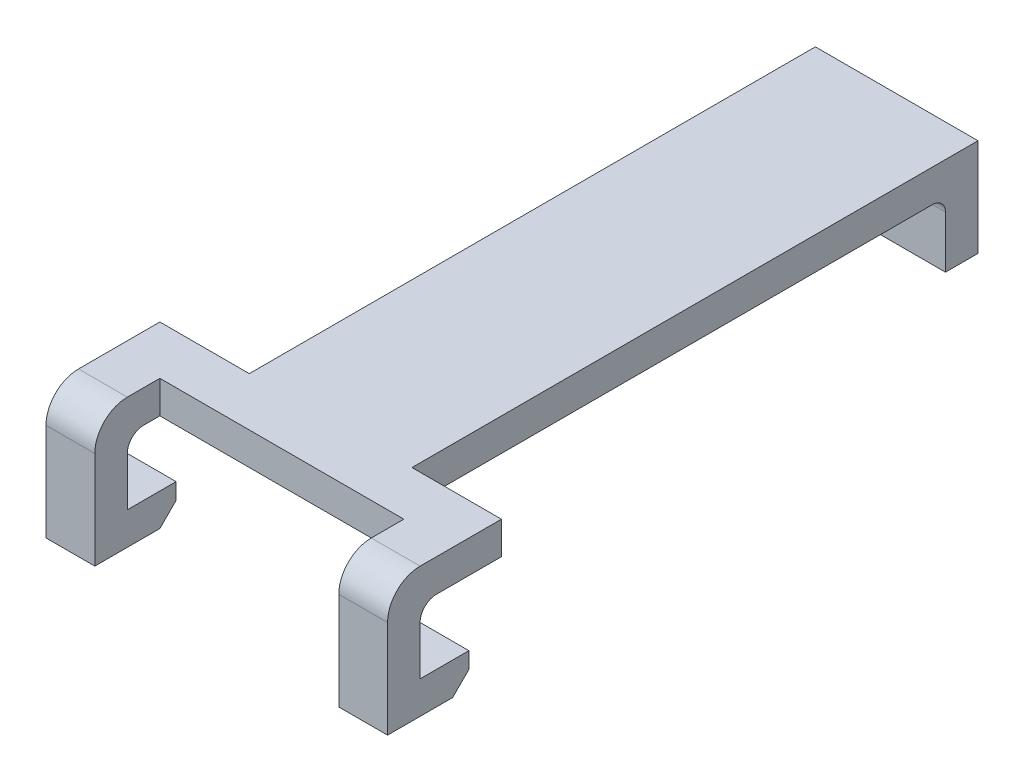
ISO-10303-21;
HEADER;
FILE_DESCRIPTION(('STEP AP214'),'2;1');
FILE_NAME('part.step','',(''),(''),'','','');
FILE_SCHEMA(('AUTOMOTIVE_DESIGN { 1 0 10303 214 1 1 1 1 }'));
ENDSEC;
DATA;
#1=APPLICATION_CONTEXT('core data for automotive mechanical design processes');
#2=APPLICATION_PROTOCOL_DEFINITION('international standard','automotive_design',2000,#1);
#3=PRODUCT_CONTEXT('',#1,'mechanical');
#4=PRODUCT('Part','Part','',(#3));
#5=PRODUCT_RELATED_PRODUCT_CATEGORY('part','',(#4));
#6=PRODUCT_DEFINITION_FORMATION('','',#4);
#7=PRODUCT_DEFINITION_CONTEXT('part definition',#1,'design');
#8=PRODUCT_DEFINITION('design','',#6,#7);
#9=PRODUCT_DEFINITION_SHAPE('','',#8);
#10=(LENGTH_UNIT() NAMED_UNIT(*) SI_UNIT(.MILLI.,.METRE.));
#11=(NAMED_UNIT(*) PLANE_ANGLE_UNIT() SI_UNIT($,.RADIAN.));
#12=(NAMED_UNIT(*) SI_UNIT($,.STERADIAN.) SOLID_ANGLE_UNIT());
#13=UNCERTAINTY_MEASURE_WITH_UNIT(LENGTH_MEASURE(1.E-05),#10,'distance_accuracy_value','');
#14=(GEOMETRIC_REPRESENTATION_CONTEXT(3) GLOBAL_UNCERTAINTY_ASSIGNED_CONTEXT((#13)) GLOBAL_UNIT_ASSIGNED_CONTEXT((#10,
#11,#12)) REPRESENTATION_CONTEXT('',''));
#15=CARTESIAN_POINT('',(0.,0.,0.));
#16=DIRECTION('',(0.,0.,1.));
#17=DIRECTION('',(1.,0.,0.));
#18=AXIS2_PLACEMENT_3D('',#15,#16,#17);
#19=CARTESIAN_POINT('',(0.,1.,18.9));
#20=DIRECTION('',(0.,0.,-1.));
#21=DIRECTION('',(-1.,0.,0.));
#22=AXIS2_PLACEMENT_3D('',#19,#20,#21);
#23=PLANE('',#22);
#24=DIRECTION('',(0.,-1.,0.));
#25=VECTOR('',#24,1.);
#26=CARTESIAN_POINT('',(7.50000000000001,1.,18.9));
#27=LINE('',#26,#25);
#28=CARTESIAN_POINT('',(7.50000000000001,1.,18.9));
#29=VERTEX_POINT('',#28);
#30=CARTESIAN_POINT('',(7.50000000000001,-1.,18.9));
#31=VERTEX_POINT('',#30);
#32=EDGE_CURVE('E469',#29,#31,#27,.T.);
#33=ORIENTED_EDGE('',*,*,#32,.F.);
#34=DIRECTION('',(1.,0.,0.));
#35=VECTOR('',#34,1.);
#36=CARTESIAN_POINT('',(0.,1.,18.9));
#37=LINE('',#36,#35);
#38=CARTESIAN_POINT('',(-7.5,1.,18.9));
#39=VERTEX_POINT('',#38);
#40=EDGE_CURVE('E399',#39,#29,#37,.T.);
#41=ORIENTED_EDGE('',*,*,#40,.F.);
#42=DIRECTION('',(0.,1.,0.));
#43=VECTOR('',#42,1.);
#44=CARTESIAN_POINT('',(-7.5,1.,18.9));
#45=LINE('',#44,#43);
#46=CARTESIAN_POINT('',(-7.5,-1.,18.9));
#47=VERTEX_POINT('',#46);
#48=EDGE_CURVE('E297',#47,#39,#45,.T.);
#49=ORIENTED_EDGE('',*,*,#48,.F.);
#50=DIRECTION('',(1.,0.,0.));
#51=VECTOR('',#50,1.);
#52=CARTESIAN_POINT('',(0.,-1.,18.9));
#53=LINE('',#52,#51);
#54=EDGE_CURVE('E422',#47,#31,#53,.T.);
#55=ORIENTED_EDGE('',*,*,#54,.T.);
#56=EDGE_LOOP('',(#33,#41,#49,#55));
#57=FACE_BOUND('',#56,.T.);
#58=ADVANCED_FACE('F38',(#57),#23,.F.);
#59=CARTESIAN_POINT('',(0.,-1.,0.));
#60=DIRECTION('',(0.,1.,0.));
#61=DIRECTION('',(0.,0.,1.));
#62=AXIS2_PLACEMENT_3D('',#59,#60,#61);
#63=PLANE('',#62);
#64=DIRECTION('',(0.,0.,1.));
#65=VECTOR('',#64,1.);
#66=CARTESIAN_POINT('',(-5.,-1.,0.));
#67=LINE('',#66,#65);
#68=CARTESIAN_POINT('',(-5.,-1.,-16.1));
#69=VERTEX_POINT('',#68);
#70=CARTESIAN_POINT('',(-5.,-1.,15.9));
#71=VERTEX_POINT('',#70);
#72=EDGE_CURVE('E413',#69,#71,#67,.T.);
#73=ORIENTED_EDGE('',*,*,#72,.F.);
#74=DIRECTION('',(-1.,0.,0.));
#75=VECTOR('',#74,1.);
#76=CARTESIAN_POINT('',(5.,-1.,-16.1));
#77=LINE('',#76,#75);
#78=CARTESIAN_POINT('',(5.,-1.,-16.1));
#79=VERTEX_POINT('',#78);
#80=EDGE_CURVE('E60',#69,#79,#77,.F.);
#81=ORIENTED_EDGE('',*,*,#80,.T.);
#82=DIRECTION('',(0.,0.,1.));
#83=VECTOR('',#82,1.);
#84=CARTESIAN_POINT('',(5.,-1.,0.));
#85=LINE('',#84,#83);
#86=CARTESIAN_POINT('',(5.,-1.,15.9));
#87=VERTEX_POINT('',#86);
#88=EDGE_CURVE('E380',#79,#87,#85,.T.);
#89=ORIENTED_EDGE('',*,*,#88,.T.);
#90=DIRECTION('',(1.,0.,0.));
#91=VECTOR('',#90,1.);
#92=CARTESIAN_POINT('',(0.,-1.,15.9));
#93=LINE('',#92,#91);
#94=CARTESIAN_POINT('',(10.5,-1.,15.9));
#95=VERTEX_POINT('',#94);
#96=EDGE_CURVE('E386',#87,#95,#93,.T.);
#97=ORIENTED_EDGE('',*,*,#96,.T.);
#98=DIRECTION('',(0.,0.,1.));
#99=VECTOR('',#98,1.);
#100=CARTESIAN_POINT('',(10.5,-1.,0.));
#101=LINE('',#100,#99);
#102=CARTESIAN_POINT('',(10.5,-1.,19.9));
#103=VERTEX_POINT('',#102);
#104=EDGE_CURVE('E426',#95,#103,#101,.T.);
#105=ORIENTED_EDGE('',*,*,#104,.T.);
#106=DIRECTION('',(1.,0.,0.));
#107=VECTOR('',#106,1.);
#108=CARTESIAN_POINT('',(7.50000000000001,-1.,19.9));
#109=LINE('',#108,#107);
#110=CARTESIAN_POINT('',(7.50000000000001,-1.,19.9));
#111=VERTEX_POINT('',#110);
#112=EDGE_CURVE('E481',#111,#103,#109,.T.);
#113=ORIENTED_EDGE('',*,*,#112,.F.);
#114=DIRECTION('',(0.,0.,1.));
#115=VECTOR('',#114,1.);
#116=CARTESIAN_POINT('',(7.49999999999998,-1.,0.));
#117=LINE('',#116,#115);
#118=EDGE_CURVE('E245',#31,#111,#117,.T.);
#119=ORIENTED_EDGE('',*,*,#118,.F.);
#120=ORIENTED_EDGE('',*,*,#54,.F.);
#121=DIRECTION('',(0.,0.,-1.));
#122=VECTOR('',#121,1.);
#123=CARTESIAN_POINT('',(-7.5,-1.,0.));
#124=LINE('',#123,#122);
#125=CARTESIAN_POINT('',(-7.5,-1.,19.9));
#126=VERTEX_POINT('',#125);
#127=EDGE_CURVE('E301',#126,#47,#124,.T.);
#128=ORIENTED_EDGE('',*,*,#127,.F.);
#129=DIRECTION('',(-1.,0.,0.));
#130=VECTOR('',#129,1.);
#131=CARTESIAN_POINT('',(-7.5,-1.,19.9));
#132=LINE('',#131,#130);
#133=CARTESIAN_POINT('',(-10.5,-1.,19.9));
#134=VERTEX_POINT('',#133);
#135=EDGE_CURVE('E325',#126,#134,#132,.T.);
#136=ORIENTED_EDGE('',*,*,#135,.T.);
#137=DIRECTION('',(0.,0.,1.));
#138=VECTOR('',#137,1.);
#139=CARTESIAN_POINT('',(-10.5,-1.,0.));
#140=LINE('',#139,#138);
#141=CARTESIAN_POINT('',(-10.5,-1.,15.9));
#142=VERTEX_POINT('',#141);
#143=EDGE_CURVE('E419',#142,#134,#140,.T.);
#144=ORIENTED_EDGE('',*,*,#143,.F.);
#145=DIRECTION('',(-1.,0.,0.));
#146=VECTOR('',#145,1.);
#147=CARTESIAN_POINT('',(0.,-1.,15.9));
#148=LINE('',#147,#146);
#149=EDGE_CURVE('E416',#71,#142,#148,.T.);
#150=ORIENTED_EDGE('',*,*,#149,.F.);
#151=EDGE_LOOP('',(#73,#81,#89,#97,#105,#113,#119,#120,#128,#136,#144,#150));
#152=FACE_BOUND('',#151,.T.);
#153=ADVANCED_FACE('F557',(#152),#63,.F.);
#154=CARTESIAN_POINT('',(5.,1.,0.));
#155=DIRECTION('',(1.,0.,0.));
#156=DIRECTION('',(0.,0.,-1.));
#157=AXIS2_PLACEMENT_3D('',#154,#155,#156);
#158=PLANE('',#157);
#159=ORIENTED_EDGE('',*,*,#88,.F.);
#160=CARTESIAN_POINT('',(5.,-1.8,-16.1));
#161=DIRECTION('',(1.,0.,0.));
#162=DIRECTION('',(0.,0.,-1.));
#163=AXIS2_PLACEMENT_3D('',#160,#161,#162);
#164=CIRCLE('',#163,0.8);
#165=CARTESIAN_POINT('',(5.,-1.8,-16.9));
#166=VERTEX_POINT('',#165);
#167=EDGE_CURVE('E11',#79,#166,#164,.F.);
#168=ORIENTED_EDGE('',*,*,#167,.T.);
#169=DIRECTION('',(0.,1.,0.));
#170=VECTOR('',#169,1.);
#171=CARTESIAN_POINT('',(5.,-5.,-16.9));
#172=LINE('',#171,#170);
#173=CARTESIAN_POINT('',(5.,-5.,-16.9));
#174=VERTEX_POINT('',#173);
#175=EDGE_CURVE('E376',#174,#166,#172,.T.);
#176=ORIENTED_EDGE('',*,*,#175,.F.);
#177=DIRECTION('',(0.,0.,1.));
#178=VECTOR('',#177,1.);
#179=CARTESIAN_POINT('',(5.,-5.,-18.9));
#180=LINE('',#179,#178);
#181=CARTESIAN_POINT('',(5.,-5.,-18.9));
#182=VERTEX_POINT('',#181);
#183=EDGE_CURVE('E367',#182,#174,#180,.T.);
#184=ORIENTED_EDGE('',*,*,#183,.F.);
#185=DIRECTION('',(0.,-1.,0.));
#186=VECTOR('',#185,1.);
#187=CARTESIAN_POINT('',(5.,1.,-18.9));
#188=LINE('',#187,#186);
#189=CARTESIAN_POINT('',(5.,1.,-18.9));
#190=VERTEX_POINT('',#189);
#191=EDGE_CURVE('E449',#190,#182,#188,.T.);
#192=ORIENTED_EDGE('',*,*,#191,.F.);
#193=DIRECTION('',(0.,0.,1.));
#194=VECTOR('',#193,1.);
#195=CARTESIAN_POINT('',(5.,1.,0.));
#196=LINE('',#195,#194);
#197=CARTESIAN_POINT('',(5.,1.,15.9));
#198=VERTEX_POINT('',#197);
#199=EDGE_CURVE('E381',#190,#198,#196,.T.);
#200=ORIENTED_EDGE('',*,*,#199,.T.);
#201=DIRECTION('',(0.,-1.,0.));
#202=VECTOR('',#201,1.);
#203=CARTESIAN_POINT('',(5.,1.,15.9));
#204=LINE('',#203,#202);
#205=EDGE_CURVE('E410',#198,#87,#204,.T.);
#206=ORIENTED_EDGE('',*,*,#205,.T.);
#207=EDGE_LOOP('',(#159,#168,#176,#184,#192,#200,#206));
#208=FACE_BOUND('',#207,.T.);
#209=ADVANCED_FACE('F563',(#208),#158,.T.);
#210=CARTESIAN_POINT('',(0.,1.,-18.9));
#211=DIRECTION('',(0.,0.,-1.));
#212=DIRECTION('',(-1.,0.,0.));
#213=AXIS2_PLACEMENT_3D('',#210,#211,#212);
#214=PLANE('',#213);
#215=ORIENTED_EDGE('',*,*,#191,.T.);
#216=DIRECTION('',(1.,0.,0.));
#217=VECTOR('',#216,1.);
#218=CARTESIAN_POINT('',(-5.,-5.,-18.9));
#219=LINE('',#218,#217);
#220=CARTESIAN_POINT('',(-5.,-5.,-18.9));
#221=VERTEX_POINT('',#220);
#222=EDGE_CURVE('E363',#221,#182,#219,.T.);
#223=ORIENTED_EDGE('',*,*,#222,.F.);
#224=DIRECTION('',(0.,-1.,0.));
#225=VECTOR('',#224,1.);
#226=CARTESIAN_POINT('',(-5.,1.,-18.9));
#227=LINE('',#226,#225);
#228=CARTESIAN_POINT('',(-5.,1.,-18.9));
#229=VERTEX_POINT('',#228);
#230=EDGE_CURVE('E446',#229,#221,#227,.T.);
#231=ORIENTED_EDGE('',*,*,#230,.F.);
#232=DIRECTION('',(1.,0.,0.));
#233=VECTOR('',#232,1.);
#234=CARTESIAN_POINT('',(0.,1.,-18.9));
#235=LINE('',#234,#233);
#236=EDGE_CURVE('E385',#229,#190,#235,.T.);
#237=ORIENTED_EDGE('',*,*,#236,.T.);
#238=EDGE_LOOP('',(#215,#223,#231,#237));
#239=FACE_BOUND('',#238,.T.);
#240=ADVANCED_FACE('F580',(#239),#214,.T.);
#241=CARTESIAN_POINT('',(-5.,1.,0.));
#242=DIRECTION('',(1.,0.,0.));
#243=DIRECTION('',(0.,0.,-1.));
#244=AXIS2_PLACEMENT_3D('',#241,#242,#243);
#245=PLANE('',#244);
#246=ORIENTED_EDGE('',*,*,#230,.T.);
#247=DIRECTION('',(0.,0.,-1.));
#248=VECTOR('',#247,1.);
#249=CARTESIAN_POINT('',(-5.,-5.,-18.9));
#250=LINE('',#249,#248);
#251=CARTESIAN_POINT('',(-5.,-5.,-16.9));
#252=VERTEX_POINT('',#251);
#253=EDGE_CURVE('E329',#252,#221,#250,.T.);
#254=ORIENTED_EDGE('',*,*,#253,.F.);
#255=DIRECTION('',(0.,1.,0.));
#256=VECTOR('',#255,1.);
#257=CARTESIAN_POINT('',(-5.,-5.,-16.9));
#258=LINE('',#257,#256);
#259=CARTESIAN_POINT('',(-5.,-1.8,-16.9));
#260=VERTEX_POINT('',#259);
#261=EDGE_CURVE('E373',#252,#260,#258,.T.);
#262=ORIENTED_EDGE('',*,*,#261,.T.);
#263=CARTESIAN_POINT('',(-5.,-1.8,-16.1));
#264=DIRECTION('',(1.,0.,0.));
#265=DIRECTION('',(0.,0.,-1.));
#266=AXIS2_PLACEMENT_3D('',#263,#264,#265);
#267=CIRCLE('',#266,0.8);
#268=EDGE_CURVE('E47',#260,#69,#267,.T.);
#269=ORIENTED_EDGE('',*,*,#268,.T.);
#270=ORIENTED_EDGE('',*,*,#72,.T.);
#271=DIRECTION('',(0.,-1.,0.));
#272=VECTOR('',#271,1.);
#273=CARTESIAN_POINT('',(-5.,1.,15.9));
#274=LINE('',#273,#272);
#275=CARTESIAN_POINT('',(-5.,1.,15.9));
#276=VERTEX_POINT('',#275);
#277=EDGE_CURVE('E442',#276,#71,#274,.T.);
#278=ORIENTED_EDGE('',*,*,#277,.F.);
#279=DIRECTION('',(0.,0.,1.));
#280=VECTOR('',#279,1.);
#281=CARTESIAN_POINT('',(-5.,1.,0.));
#282=LINE('',#281,#280);
#283=EDGE_CURVE('E390',#229,#276,#282,.T.);
#284=ORIENTED_EDGE('',*,*,#283,.F.);
#285=EDGE_LOOP('',(#246,#254,#262,#269,#270,#278,#284));
#286=FACE_BOUND('',#285,.T.);
#287=ADVANCED_FACE('F576',(#286),#245,.F.);
#288=CARTESIAN_POINT('',(0.,1.,15.9));
#289=DIRECTION('',(0.,0.,1.));
#290=DIRECTION('',(1.,0.,0.));
#291=AXIS2_PLACEMENT_3D('',#288,#289,#290);
#292=PLANE('',#291);
#293=ORIENTED_EDGE('',*,*,#149,.T.);
#294=DIRECTION('',(0.,-1.,0.));
#295=VECTOR('',#294,1.);
#296=CARTESIAN_POINT('',(-10.5,1.,15.9));
#297=LINE('',#296,#295);
#298=CARTESIAN_POINT('',(-10.5,1.,15.9));
#299=VERTEX_POINT('',#298);
#300=EDGE_CURVE('E438',#299,#142,#297,.T.);
#301=ORIENTED_EDGE('',*,*,#300,.F.);
#302=DIRECTION('',(-1.,0.,0.));
#303=VECTOR('',#302,1.);
#304=CARTESIAN_POINT('',(0.,1.,15.9));
#305=LINE('',#304,#303);
#306=EDGE_CURVE('E393',#276,#299,#305,.T.);
#307=ORIENTED_EDGE('',*,*,#306,.F.);
#308=ORIENTED_EDGE('',*,*,#277,.T.);
#309=EDGE_LOOP('',(#293,#301,#307,#308));
#310=FACE_BOUND('',#309,.T.);
#311=ADVANCED_FACE('F572',(#310),#292,.F.);
#312=CARTESIAN_POINT('',(-10.5,1.,0.));
#313=DIRECTION('',(1.,0.,0.));
#314=DIRECTION('',(0.,0.,-1.));
#315=AXIS2_PLACEMENT_3D('',#312,#313,#314);
#316=PLANE('',#315);
#317=ORIENTED_EDGE('',*,*,#143,.T.);
#318=CARTESIAN_POINT('',(-10.5,-2.,19.9));
#319=DIRECTION('',(1.,0.,0.));
#320=DIRECTION('',(0.,0.,-1.));
#321=AXIS2_PLACEMENT_3D('',#318,#319,#320);
#322=CIRCLE('',#321,1.);
#323=CARTESIAN_POINT('',(-10.5,-2.,20.9));
#324=VERTEX_POINT('',#323);
#325=EDGE_CURVE('E256',#134,#324,#322,.T.);
#326=ORIENTED_EDGE('',*,*,#325,.T.);
#327=DIRECTION('',(0.,1.,0.));
#328=VECTOR('',#327,1.);
#329=CARTESIAN_POINT('',(-10.5,1.,20.9));
#330=LINE('',#329,#328);
#331=CARTESIAN_POINT('',(-10.5,-5.,20.9));
#332=VERTEX_POINT('',#331);
#333=EDGE_CURVE('E262',#332,#324,#330,.T.);
#334=ORIENTED_EDGE('',*,*,#333,.F.);
#335=DIRECTION('',(0.,0.,1.));
#336=VECTOR('',#335,1.);
#337=CARTESIAN_POINT('',(-10.5,-5.,0.));
#338=LINE('',#337,#336);
#339=CARTESIAN_POINT('',(-10.5,-5.,17.9));
#340=VERTEX_POINT('',#339);
#341=EDGE_CURVE('E308',#340,#332,#338,.T.);
#342=ORIENTED_EDGE('',*,*,#341,.F.);
#343=DIRECTION('',(0.,1.,0.));
#344=VECTOR('',#343,1.);
#345=CARTESIAN_POINT('',(-10.5,1.,17.9));
#346=LINE('',#345,#344);
#347=CARTESIAN_POINT('',(-10.5,-6.,17.9));
#348=VERTEX_POINT('',#347);
#349=EDGE_CURVE('E311',#348,#340,#346,.T.);
#350=ORIENTED_EDGE('',*,*,#349,.F.);
#351=DIRECTION('',(0.,0.707106781186546,-0.707106781186549));
#352=VECTOR('',#351,1.);
#353=CARTESIAN_POINT('',(-10.5,6.44999999999998,5.44999999999997));
#354=LINE('',#353,#352);
#355=CARTESIAN_POINT('',(-10.5,-7.,18.9));
#356=VERTEX_POINT('',#355);
#357=EDGE_CURVE('E314',#356,#348,#354,.T.);
#358=ORIENTED_EDGE('',*,*,#357,.F.);
#359=DIRECTION('',(0.,0.,-1.));
#360=VECTOR('',#359,1.);
#361=CARTESIAN_POINT('',(-10.5,-7.,0.));
#362=LINE('',#361,#360);
#363=CARTESIAN_POINT('',(-10.5,-7.,22.9));
#364=VERTEX_POINT('',#363);
#365=EDGE_CURVE('E317',#364,#356,#362,.T.);
#366=ORIENTED_EDGE('',*,*,#365,.F.);
#367=DIRECTION('',(0.,-1.,0.));
#368=VECTOR('',#367,1.);
#369=CARTESIAN_POINT('',(-10.5,1.00000000000001,22.9));
#370=LINE('',#369,#368);
#371=CARTESIAN_POINT('',(-10.5,-1.,22.9));
#372=VERTEX_POINT('',#371);
#373=EDGE_CURVE('E320',#372,#364,#370,.T.);
#374=ORIENTED_EDGE('',*,*,#373,.F.);
#375=CARTESIAN_POINT('',(-10.5,-1.,20.9));
#376=DIRECTION('',(1.,0.,0.));
#377=DIRECTION('',(0.,0.,-1.));
#378=AXIS2_PLACEMENT_3D('',#375,#376,#377);
#379=CIRCLE('',#378,2.);
#380=CARTESIAN_POINT('',(-10.5,1.,20.9));
#381=VERTEX_POINT('',#380);
#382=EDGE_CURVE('E274',#381,#372,#379,.T.);
#383=ORIENTED_EDGE('',*,*,#382,.F.);
#384=DIRECTION('',(0.,0.,1.));
#385=VECTOR('',#384,1.);
#386=CARTESIAN_POINT('',(-10.5,1.,0.));
#387=LINE('',#386,#385);
#388=EDGE_CURVE('E396',#299,#381,#387,.T.);
#389=ORIENTED_EDGE('',*,*,#388,.F.);
#390=ORIENTED_EDGE('',*,*,#300,.T.);
#391=EDGE_LOOP('',(#317,#326,#334,#342,#350,#358,#366,#374,#383,#389,#390));
#392=FACE_BOUND('',#391,.T.);
#393=ADVANCED_FACE('F569',(#392),#316,.F.);
#394=CARTESIAN_POINT('',(10.5,1.,0.));
#395=DIRECTION('',(1.,0.,0.));
#396=DIRECTION('',(0.,0.,-1.));
#397=AXIS2_PLACEMENT_3D('',#394,#395,#396);
#398=PLANE('',#397);
#399=ORIENTED_EDGE('',*,*,#104,.F.);
#400=DIRECTION('',(0.,-1.,0.));
#401=VECTOR('',#400,1.);
#402=CARTESIAN_POINT('',(10.5,1.,15.9));
#403=LINE('',#402,#401);
#404=CARTESIAN_POINT('',(10.5,1.,15.9));
#405=VERTEX_POINT('',#404);
#406=EDGE_CURVE('E435',#405,#95,#403,.T.);
#407=ORIENTED_EDGE('',*,*,#406,.F.);
#408=DIRECTION('',(0.,0.,1.));
#409=VECTOR('',#408,1.);
#410=CARTESIAN_POINT('',(10.5,1.,0.));
#411=LINE('',#410,#409);
#412=CARTESIAN_POINT('',(10.5,1.,20.9));
#413=VERTEX_POINT('',#412);
#414=EDGE_CURVE('E403',#405,#413,#411,.T.);
#415=ORIENTED_EDGE('',*,*,#414,.T.);
#416=CARTESIAN_POINT('',(10.5,-1.,20.9));
#417=DIRECTION('',(1.,0.,0.));
#418=DIRECTION('',(0.,0.,-1.));
#419=AXIS2_PLACEMENT_3D('',#416,#417,#418);
#420=CIRCLE('',#419,2.);
#421=CARTESIAN_POINT('',(10.5,-1.,22.9));
#422=VERTEX_POINT('',#421);
#423=EDGE_CURVE('E250',#413,#422,#420,.T.);
#424=ORIENTED_EDGE('',*,*,#423,.T.);
#425=DIRECTION('',(0.,1.,0.));
#426=VECTOR('',#425,1.);
#427=CARTESIAN_POINT('',(10.5,1.00000000000001,22.9));
#428=LINE('',#427,#426);
#429=CARTESIAN_POINT('',(10.5,-7.,22.9));
#430=VERTEX_POINT('',#429);
#431=EDGE_CURVE('E464',#430,#422,#428,.T.);
#432=ORIENTED_EDGE('',*,*,#431,.F.);
#433=DIRECTION('',(0.,0.,1.));
#434=VECTOR('',#433,1.);
#435=CARTESIAN_POINT('',(10.5,-7.,0.));
#436=LINE('',#435,#434);
#437=CARTESIAN_POINT('',(10.5,-7.,18.9));
#438=VERTEX_POINT('',#437);
#439=EDGE_CURVE('E466',#438,#430,#436,.T.);
#440=ORIENTED_EDGE('',*,*,#439,.F.);
#441=DIRECTION('',(0.,-0.707106781186546,0.707106781186549));
#442=VECTOR('',#441,1.);
#443=CARTESIAN_POINT('',(10.5,6.44999999999999,5.44999999999996));
#444=LINE('',#443,#442);
#445=CARTESIAN_POINT('',(10.5,-6.,17.9));
#446=VERTEX_POINT('',#445);
#447=EDGE_CURVE('E478',#446,#438,#444,.T.);
#448=ORIENTED_EDGE('',*,*,#447,.F.);
#449=DIRECTION('',(0.,-1.,0.));
#450=VECTOR('',#449,1.);
#451=CARTESIAN_POINT('',(10.5,1.,17.9));
#452=LINE('',#451,#450);
#453=CARTESIAN_POINT('',(10.5,-5.,17.9));
#454=VERTEX_POINT('',#453);
#455=EDGE_CURVE('E477',#454,#446,#452,.T.);
#456=ORIENTED_EDGE('',*,*,#455,.F.);
#457=DIRECTION('',(0.,0.,-1.));
#458=VECTOR('',#457,1.);
#459=CARTESIAN_POINT('',(10.5,-5.,0.));
#460=LINE('',#459,#458);
#461=CARTESIAN_POINT('',(10.5,-5.,20.9));
#462=VERTEX_POINT('',#461);
#463=EDGE_CURVE('E479',#462,#454,#460,.T.);
#464=ORIENTED_EDGE('',*,*,#463,.F.);
#465=DIRECTION('',(0.,-1.,0.));
#466=VECTOR('',#465,1.);
#467=CARTESIAN_POINT('',(10.5,1.,20.9));
#468=LINE('',#467,#466);
#469=CARTESIAN_POINT('',(10.5,-2.,20.9));
#470=VERTEX_POINT('',#469);
#471=EDGE_CURVE('E534',#470,#462,#468,.T.);
#472=ORIENTED_EDGE('',*,*,#471,.F.);
#473=CARTESIAN_POINT('',(10.5,-2.,19.9));
#474=DIRECTION('',(1.,0.,0.));
#475=DIRECTION('',(0.,0.,-1.));
#476=AXIS2_PLACEMENT_3D('',#473,#474,#475);
#477=CIRCLE('',#476,1.);
#478=EDGE_CURVE('E254',#103,#470,#477,.T.);
#479=ORIENTED_EDGE('',*,*,#478,.F.);
#480=EDGE_LOOP('',(#399,#407,#415,#424,#432,#440,#448,#456,#464,#472,#479));
#481=FACE_BOUND('',#480,.T.);
#482=ADVANCED_FACE('F520',(#481),#398,.T.);
#483=CARTESIAN_POINT('',(0.,1.,15.9));
#484=DIRECTION('',(0.,0.,-1.));
#485=DIRECTION('',(-1.,0.,0.));
#486=AXIS2_PLACEMENT_3D('',#483,#484,#485);
#487=PLANE('',#486);
#488=ORIENTED_EDGE('',*,*,#96,.F.);
#489=ORIENTED_EDGE('',*,*,#205,.F.);
#490=DIRECTION('',(1.,0.,0.));
#491=VECTOR('',#490,1.);
#492=CARTESIAN_POINT('',(0.,1.,15.9));
#493=LINE('',#492,#491);
#494=EDGE_CURVE('E406',#198,#405,#493,.T.);
#495=ORIENTED_EDGE('',*,*,#494,.T.);
#496=ORIENTED_EDGE('',*,*,#406,.T.);
#497=EDGE_LOOP('',(#488,#489,#495,#496));
#498=FACE_BOUND('',#497,.T.);
#499=ADVANCED_FACE('F640',(#498),#487,.T.);
#500=CARTESIAN_POINT('',(0.,1.,0.));
#501=DIRECTION('',(0.,1.,0.));
#502=DIRECTION('',(0.,0.,1.));
#503=AXIS2_PLACEMENT_3D('',#500,#501,#502);
#504=PLANE('',#503);
#505=ORIENTED_EDGE('',*,*,#199,.F.);
#506=ORIENTED_EDGE('',*,*,#236,.F.);
#507=ORIENTED_EDGE('',*,*,#283,.T.);
#508=ORIENTED_EDGE('',*,*,#306,.T.);
#509=ORIENTED_EDGE('',*,*,#388,.T.);
#510=DIRECTION('',(-1.,0.,0.));
#511=VECTOR('',#510,1.);
#512=CARTESIAN_POINT('',(-7.5,1.,20.9));
#513=LINE('',#512,#511);
#514=CARTESIAN_POINT('',(-7.5,1.,20.9));
#515=VERTEX_POINT('',#514);
#516=EDGE_CURVE('E330',#515,#381,#513,.T.);
#517=ORIENTED_EDGE('',*,*,#516,.F.);
#518=DIRECTION('',(0.,0.,1.));
#519=VECTOR('',#518,1.);
#520=CARTESIAN_POINT('',(-7.5,1.,0.));
#521=LINE('',#520,#519);
#522=EDGE_CURVE('E294',#39,#515,#521,.T.);
#523=ORIENTED_EDGE('',*,*,#522,.F.);
#524=ORIENTED_EDGE('',*,*,#40,.T.);
#525=DIRECTION('',(0.,0.,-1.));
#526=VECTOR('',#525,1.);
#527=CARTESIAN_POINT('',(7.49999999999998,1.,0.));
#528=LINE('',#527,#526);
#529=CARTESIAN_POINT('',(7.50000000000001,1.,20.9));
#530=VERTEX_POINT('',#529);
#531=EDGE_CURVE('E471',#530,#29,#528,.T.);
#532=ORIENTED_EDGE('',*,*,#531,.F.);
#533=DIRECTION('',(1.,0.,0.));
#534=VECTOR('',#533,1.);
#535=CARTESIAN_POINT('',(7.50000000000001,1.,20.9));
#536=LINE('',#535,#534);
#537=EDGE_CURVE('E482',#530,#413,#536,.T.);
#538=ORIENTED_EDGE('',*,*,#537,.T.);
#539=ORIENTED_EDGE('',*,*,#414,.F.);
#540=ORIENTED_EDGE('',*,*,#494,.F.);
#541=EDGE_LOOP('',(#505,#506,#507,#508,#509,#517,#523,#524,#532,#538,#539,#540));
#542=FACE_BOUND('',#541,.T.);
#543=ADVANCED_FACE('F606',(#542),#504,.T.);
#544=CARTESIAN_POINT('',(-5.,-5.,-16.9));
#545=DIRECTION('',(0.,0.,-1.));
#546=DIRECTION('',(-1.,0.,0.));
#547=AXIS2_PLACEMENT_3D('',#544,#545,#546);
#548=PLANE('',#547);
#549=ORIENTED_EDGE('',*,*,#175,.T.);
#550=DIRECTION('',(-1.,0.,0.));
#551=VECTOR('',#550,1.);
#552=CARTESIAN_POINT('',(-5.,-1.8,-16.9));
#553=LINE('',#552,#551);
#554=EDGE_CURVE('E452',#166,#260,#553,.T.);
#555=ORIENTED_EDGE('',*,*,#554,.T.);
#556=ORIENTED_EDGE('',*,*,#261,.F.);
#557=DIRECTION('',(-1.,0.,0.));
#558=VECTOR('',#557,1.);
#559=CARTESIAN_POINT('',(-5.,-5.,-16.9));
#560=LINE('',#559,#558);
#561=EDGE_CURVE('E370',#174,#252,#560,.T.);
#562=ORIENTED_EDGE('',*,*,#561,.F.);
#563=EDGE_LOOP('',(#549,#555,#556,#562));
#564=FACE_BOUND('',#563,.T.);
#565=ADVANCED_FACE('F594',(#564),#548,.F.);
#566=CARTESIAN_POINT('',(0.,-5.,0.));
#567=DIRECTION('',(0.,1.,0.));
#568=DIRECTION('',(0.,0.,1.));
#569=AXIS2_PLACEMENT_3D('',#566,#567,#568);
#570=PLANE('',#569);
#571=ORIENTED_EDGE('',*,*,#253,.T.);
#572=ORIENTED_EDGE('',*,*,#222,.T.);
#573=ORIENTED_EDGE('',*,*,#183,.T.);
#574=ORIENTED_EDGE('',*,*,#561,.T.);
#575=EDGE_LOOP('',(#571,#572,#573,#574));
#576=FACE_BOUND('',#575,.T.);
#577=ADVANCED_FACE('F600',(#576),#570,.F.);
#578=CARTESIAN_POINT('',(-7.5,-2.,19.9));
#579=DIRECTION('',(-1.,0.,0.));
#580=DIRECTION('',(0.,0.,1.));
#581=AXIS2_PLACEMENT_3D('',#578,#579,#580);
#582=CYLINDRICAL_SURFACE('',#581,1.);
#583=ORIENTED_EDGE('',*,*,#325,.F.);
#584=ORIENTED_EDGE('',*,*,#135,.F.);
#585=CARTESIAN_POINT('',(-7.5,-2.,19.9));
#586=DIRECTION('',(1.,0.,0.));
#587=DIRECTION('',(0.,0.,-1.));
#588=AXIS2_PLACEMENT_3D('',#585,#586,#587);
#589=CIRCLE('',#588,1.);
#590=CARTESIAN_POINT('',(-7.5,-2.,20.9));
#591=VERTEX_POINT('',#590);
#592=EDGE_CURVE('E269',#126,#591,#589,.T.);
#593=ORIENTED_EDGE('',*,*,#592,.T.);
#594=DIRECTION('',(-1.,0.,0.));
#595=VECTOR('',#594,1.);
#596=CARTESIAN_POINT('',(-7.5,-2.,20.9));
#597=LINE('',#596,#595);
#598=EDGE_CURVE('E303',#591,#324,#597,.T.);
#599=ORIENTED_EDGE('',*,*,#598,.T.);
#600=EDGE_LOOP('',(#583,#584,#593,#599));
#601=FACE_BOUND('',#600,.T.);
#602=ADVANCED_FACE('F652',(#601),#582,.F.);
#603=CARTESIAN_POINT('',(-7.5,-1.,20.9));
#604=DIRECTION('',(-1.,0.,0.));
#605=DIRECTION('',(0.,0.,1.));
#606=AXIS2_PLACEMENT_3D('',#603,#604,#605);
#607=CYLINDRICAL_SURFACE('',#606,2.);
#608=ORIENTED_EDGE('',*,*,#382,.T.);
#609=DIRECTION('',(-1.,0.,0.));
#610=VECTOR('',#609,1.);
#611=CARTESIAN_POINT('',(-7.5,-1.,22.9));
#612=LINE('',#611,#610);
#613=CARTESIAN_POINT('',(-7.5,-1.,22.9));
#614=VERTEX_POINT('',#613);
#615=EDGE_CURVE('E334',#614,#372,#612,.T.);
#616=ORIENTED_EDGE('',*,*,#615,.F.);
#617=CARTESIAN_POINT('',(-7.5,-1.,20.9));
#618=DIRECTION('',(1.,0.,0.));
#619=DIRECTION('',(0.,0.,-1.));
#620=AXIS2_PLACEMENT_3D('',#617,#618,#619);
#621=CIRCLE('',#620,2.);
#622=EDGE_CURVE('E291',#515,#614,#621,.T.);
#623=ORIENTED_EDGE('',*,*,#622,.F.);
#624=ORIENTED_EDGE('',*,*,#516,.T.);
#625=EDGE_LOOP('',(#608,#616,#623,#624));
#626=FACE_BOUND('',#625,.T.);
#627=ADVANCED_FACE('F620',(#626),#607,.T.);
#628=CARTESIAN_POINT('',(-7.5,1.00000000000001,22.9));
#629=DIRECTION('',(0.,0.,-1.));
#630=DIRECTION('',(0.,1.,0.));
#631=AXIS2_PLACEMENT_3D('',#628,#629,#630);
#632=PLANE('',#631);
#633=ORIENTED_EDGE('',*,*,#373,.T.);
#634=DIRECTION('',(-1.,0.,0.));
#635=VECTOR('',#634,1.);
#636=CARTESIAN_POINT('',(-7.5,-7.,22.9));
#637=LINE('',#636,#635);
#638=CARTESIAN_POINT('',(-7.5,-7.,22.9));
#639=VERTEX_POINT('',#638);
#640=EDGE_CURVE('E338',#639,#364,#637,.T.);
#641=ORIENTED_EDGE('',*,*,#640,.F.);
#642=DIRECTION('',(0.,-1.,0.));
#643=VECTOR('',#642,1.);
#644=CARTESIAN_POINT('',(-7.5,1.00000000000001,22.9));
#645=LINE('',#644,#643);
#646=EDGE_CURVE('E288',#614,#639,#645,.T.);
#647=ORIENTED_EDGE('',*,*,#646,.F.);
#648=ORIENTED_EDGE('',*,*,#615,.T.);
#649=EDGE_LOOP('',(#633,#641,#647,#648));
#650=FACE_BOUND('',#649,.T.);
#651=ADVANCED_FACE('F624',(#650),#632,.F.);
#652=CARTESIAN_POINT('',(-7.5,-7.,0.));
#653=DIRECTION('',(0.,1.,0.));
#654=DIRECTION('',(0.,0.,1.));
#655=AXIS2_PLACEMENT_3D('',#652,#653,#654);
#656=PLANE('',#655);
#657=ORIENTED_EDGE('',*,*,#365,.T.);
#658=DIRECTION('',(-1.,0.,0.));
#659=VECTOR('',#658,1.);
#660=CARTESIAN_POINT('',(-7.5,-7.,18.9));
#661=LINE('',#660,#659);
#662=CARTESIAN_POINT('',(-7.5,-7.,18.9));
#663=VERTEX_POINT('',#662);
#664=EDGE_CURVE('E342',#663,#356,#661,.T.);
#665=ORIENTED_EDGE('',*,*,#664,.F.);
#666=DIRECTION('',(0.,0.,-1.));
#667=VECTOR('',#666,1.);
#668=CARTESIAN_POINT('',(-7.5,-7.,0.));
#669=LINE('',#668,#667);
#670=EDGE_CURVE('E286',#639,#663,#669,.T.);
#671=ORIENTED_EDGE('',*,*,#670,.F.);
#672=ORIENTED_EDGE('',*,*,#640,.T.);
#673=EDGE_LOOP('',(#657,#665,#671,#672));
#674=FACE_BOUND('',#673,.T.);
#675=ADVANCED_FACE('F671',(#674),#656,.F.);
#676=CARTESIAN_POINT('',(-7.5,6.44999999999998,5.44999999999997));
#677=DIRECTION('',(0.,0.707106781186549,0.707106781186546));
#678=DIRECTION('',(0.,-0.707106781186546,0.707106781186549));
#679=AXIS2_PLACEMENT_3D('',#676,#677,#678);
#680=PLANE('',#679);
#681=ORIENTED_EDGE('',*,*,#357,.T.);
#682=DIRECTION('',(-1.,0.,0.));
#683=VECTOR('',#682,1.);
#684=CARTESIAN_POINT('',(-7.5,-6.,17.9));
#685=LINE('',#684,#683);
#686=CARTESIAN_POINT('',(-7.5,-6.,17.9));
#687=VERTEX_POINT('',#686);
#688=EDGE_CURVE('E346',#687,#348,#685,.T.);
#689=ORIENTED_EDGE('',*,*,#688,.F.);
#690=DIRECTION('',(0.,0.707106781186546,-0.707106781186549));
#691=VECTOR('',#690,1.);
#692=CARTESIAN_POINT('',(-7.5,6.44999999999998,5.44999999999997));
#693=LINE('',#692,#691);
#694=EDGE_CURVE('E283',#663,#687,#693,.T.);
#695=ORIENTED_EDGE('',*,*,#694,.F.);
#696=ORIENTED_EDGE('',*,*,#664,.T.);
#697=EDGE_LOOP('',(#681,#689,#695,#696));
#698=FACE_BOUND('',#697,.T.);
#699=ADVANCED_FACE('F667',(#698),#680,.F.);
#700=CARTESIAN_POINT('',(-7.5,1.,17.9));
#701=DIRECTION('',(0.,0.,1.));
#702=DIRECTION('',(1.,0.,0.));
#703=AXIS2_PLACEMENT_3D('',#700,#701,#702);
#704=PLANE('',#703);
#705=ORIENTED_EDGE('',*,*,#349,.T.);
#706=DIRECTION('',(-1.,0.,0.));
#707=VECTOR('',#706,1.);
#708=CARTESIAN_POINT('',(-7.5,-5.,17.9));
#709=LINE('',#708,#707);
#710=CARTESIAN_POINT('',(-7.5,-5.,17.9));
#711=VERTEX_POINT('',#710);
#712=EDGE_CURVE('E350',#711,#340,#709,.T.);
#713=ORIENTED_EDGE('',*,*,#712,.F.);
#714=DIRECTION('',(0.,1.,0.));
#715=VECTOR('',#714,1.);
#716=CARTESIAN_POINT('',(-7.5,1.,17.9));
#717=LINE('',#716,#715);
#718=EDGE_CURVE('E280',#687,#711,#717,.T.);
#719=ORIENTED_EDGE('',*,*,#718,.F.);
#720=ORIENTED_EDGE('',*,*,#688,.T.);
#721=EDGE_LOOP('',(#705,#713,#719,#720));
#722=FACE_BOUND('',#721,.T.);
#723=ADVANCED_FACE('F663',(#722),#704,.F.);
#724=CARTESIAN_POINT('',(-7.5,-5.,0.));
#725=DIRECTION('',(0.,-1.,0.));
#726=DIRECTION('',(0.,0.,-1.));
#727=AXIS2_PLACEMENT_3D('',#724,#725,#726);
#728=PLANE('',#727);
#729=ORIENTED_EDGE('',*,*,#341,.T.);
#730=DIRECTION('',(-1.,0.,0.));
#731=VECTOR('',#730,1.);
#732=CARTESIAN_POINT('',(-7.5,-5.,20.9));
#733=LINE('',#732,#731);
#734=CARTESIAN_POINT('',(-7.5,-5.,20.9));
#735=VERTEX_POINT('',#734);
#736=EDGE_CURVE('E354',#735,#332,#733,.T.);
#737=ORIENTED_EDGE('',*,*,#736,.F.);
#738=DIRECTION('',(0.,0.,1.));
#739=VECTOR('',#738,1.);
#740=CARTESIAN_POINT('',(-7.5,-5.,0.));
#741=LINE('',#740,#739);
#742=EDGE_CURVE('E277',#711,#735,#741,.T.);
#743=ORIENTED_EDGE('',*,*,#742,.F.);
#744=ORIENTED_EDGE('',*,*,#712,.T.);
#745=EDGE_LOOP('',(#729,#737,#743,#744));
#746=FACE_BOUND('',#745,.T.);
#747=ADVANCED_FACE('F659',(#746),#728,.F.);
#748=CARTESIAN_POINT('',(-7.5,1.,20.9));
#749=DIRECTION('',(0.,0.,1.));
#750=DIRECTION('',(1.,0.,0.));
#751=AXIS2_PLACEMENT_3D('',#748,#749,#750);
#752=PLANE('',#751);
#753=ORIENTED_EDGE('',*,*,#333,.T.);
#754=ORIENTED_EDGE('',*,*,#598,.F.);
#755=DIRECTION('',(0.,1.,0.));
#756=VECTOR('',#755,1.);
#757=CARTESIAN_POINT('',(-7.5,1.,20.9));
#758=LINE('',#757,#756);
#759=EDGE_CURVE('E273',#735,#591,#758,.T.);
#760=ORIENTED_EDGE('',*,*,#759,.F.);
#761=ORIENTED_EDGE('',*,*,#736,.T.);
#762=EDGE_LOOP('',(#753,#754,#760,#761));
#763=FACE_BOUND('',#762,.T.);
#764=ADVANCED_FACE('F656',(#763),#752,.F.);
#765=CARTESIAN_POINT('',(-7.5,-2.,19.9));
#766=DIRECTION('',(1.,0.,0.));
#767=DIRECTION('',(0.,0.,-1.));
#768=AXIS2_PLACEMENT_3D('',#765,#766,#767);
#769=PLANE('',#768);
#770=ORIENTED_EDGE('',*,*,#592,.F.);
#771=ORIENTED_EDGE('',*,*,#127,.T.);
#772=ORIENTED_EDGE('',*,*,#48,.T.);
#773=ORIENTED_EDGE('',*,*,#522,.T.);
#774=ORIENTED_EDGE('',*,*,#622,.T.);
#775=ORIENTED_EDGE('',*,*,#646,.T.);
#776=ORIENTED_EDGE('',*,*,#670,.T.);
#777=ORIENTED_EDGE('',*,*,#694,.T.);
#778=ORIENTED_EDGE('',*,*,#718,.T.);
#779=ORIENTED_EDGE('',*,*,#742,.T.);
#780=ORIENTED_EDGE('',*,*,#759,.T.);
#781=EDGE_LOOP('',(#770,#771,#772,#773,#774,#775,#776,#777,#778,#779,#780));
#782=FACE_BOUND('',#781,.T.);
#783=ADVANCED_FACE('F629',(#782),#769,.T.);
#784=CARTESIAN_POINT('',(7.50000000000001,-2.,19.9));
#785=DIRECTION('',(1.,0.,0.));
#786=DIRECTION('',(0.,0.,-1.));
#787=AXIS2_PLACEMENT_3D('',#784,#785,#786);
#788=CYLINDRICAL_SURFACE('',#787,1.);
#789=ORIENTED_EDGE('',*,*,#478,.T.);
#790=DIRECTION('',(1.,0.,0.));
#791=VECTOR('',#790,1.);
#792=CARTESIAN_POINT('',(7.50000000000001,-2.,20.9));
#793=LINE('',#792,#791);
#794=CARTESIAN_POINT('',(7.50000000000001,-2.,20.9));
#795=VERTEX_POINT('',#794);
#796=EDGE_CURVE('E232',#795,#470,#793,.T.);
#797=ORIENTED_EDGE('',*,*,#796,.F.);
#798=CARTESIAN_POINT('',(7.50000000000001,-2.,19.9));
#799=DIRECTION('',(1.,0.,0.));
#800=DIRECTION('',(0.,0.,-1.));
#801=AXIS2_PLACEMENT_3D('',#798,#799,#800);
#802=CIRCLE('',#801,1.);
#803=EDGE_CURVE('E240',#111,#795,#802,.T.);
#804=ORIENTED_EDGE('',*,*,#803,.F.);
#805=ORIENTED_EDGE('',*,*,#112,.T.);
#806=EDGE_LOOP('',(#789,#797,#804,#805));
#807=FACE_BOUND('',#806,.T.);
#808=ADVANCED_FACE('F252',(#807),#788,.F.);
#809=CARTESIAN_POINT('',(7.50000000000001,1.,20.9));
#810=DIRECTION('',(0.,0.,1.));
#811=DIRECTION('',(1.,0.,0.));
#812=AXIS2_PLACEMENT_3D('',#809,#810,#811);
#813=PLANE('',#812);
#814=ORIENTED_EDGE('',*,*,#471,.T.);
#815=DIRECTION('',(1.,0.,0.));
#816=VECTOR('',#815,1.);
#817=CARTESIAN_POINT('',(7.50000000000001,-5.,20.9));
#818=LINE('',#817,#816);
#819=CARTESIAN_POINT('',(7.50000000000001,-5.,20.9));
#820=VERTEX_POINT('',#819);
#821=EDGE_CURVE('E235',#820,#462,#818,.T.);
#822=ORIENTED_EDGE('',*,*,#821,.F.);
#823=DIRECTION('',(0.,-1.,0.));
#824=VECTOR('',#823,1.);
#825=CARTESIAN_POINT('',(7.50000000000001,1.,20.9));
#826=LINE('',#825,#824);
#827=EDGE_CURVE('E228',#795,#820,#826,.T.);
#828=ORIENTED_EDGE('',*,*,#827,.F.);
#829=ORIENTED_EDGE('',*,*,#796,.T.);
#830=EDGE_LOOP('',(#814,#822,#828,#829));
#831=FACE_BOUND('',#830,.T.);
#832=ADVANCED_FACE('F230',(#831),#813,.F.);
#833=CARTESIAN_POINT('',(7.49999999999998,-5.,0.));
#834=DIRECTION('',(0.,-1.,0.));
#835=DIRECTION('',(0.,0.,-1.));
#836=AXIS2_PLACEMENT_3D('',#833,#834,#835);
#837=PLANE('',#836);
#838=ORIENTED_EDGE('',*,*,#463,.T.);
#839=DIRECTION('',(1.,0.,0.));
#840=VECTOR('',#839,1.);
#841=CARTESIAN_POINT('',(7.5,-5.,17.9));
#842=LINE('',#841,#840);
#843=CARTESIAN_POINT('',(7.5,-5.,17.9));
#844=VERTEX_POINT('',#843);
#845=EDGE_CURVE('E265',#844,#454,#842,.T.);
#846=ORIENTED_EDGE('',*,*,#845,.F.);
#847=DIRECTION('',(0.,0.,-1.));
#848=VECTOR('',#847,1.);
#849=CARTESIAN_POINT('',(7.49999999999998,-5.,0.));
#850=LINE('',#849,#848);
#851=EDGE_CURVE('E239',#820,#844,#850,.T.);
#852=ORIENTED_EDGE('',*,*,#851,.F.);
#853=ORIENTED_EDGE('',*,*,#821,.T.);
#854=EDGE_LOOP('',(#838,#846,#852,#853));
#855=FACE_BOUND('',#854,.T.);
#856=ADVANCED_FACE('F546',(#855),#837,.F.);
#857=CARTESIAN_POINT('',(7.5,1.,17.9));
#858=DIRECTION('',(0.,0.,1.));
#859=DIRECTION('',(1.,0.,0.));
#860=AXIS2_PLACEMENT_3D('',#857,#858,#859);
#861=PLANE('',#860);
#862=ORIENTED_EDGE('',*,*,#455,.T.);
#863=DIRECTION('',(1.,0.,0.));
#864=VECTOR('',#863,1.);
#865=CARTESIAN_POINT('',(7.5,-6.,17.9));
#866=LINE('',#865,#864);
#867=CARTESIAN_POINT('',(7.5,-6.,17.9));
#868=VERTEX_POINT('',#867);
#869=EDGE_CURVE('E502',#868,#446,#866,.T.);
#870=ORIENTED_EDGE('',*,*,#869,.F.);
#871=DIRECTION('',(0.,-1.,0.));
#872=VECTOR('',#871,1.);
#873=CARTESIAN_POINT('',(7.5,1.,17.9));
#874=LINE('',#873,#872);
#875=EDGE_CURVE('E514',#844,#868,#874,.T.);
#876=ORIENTED_EDGE('',*,*,#875,.F.);
#877=ORIENTED_EDGE('',*,*,#845,.T.);
#878=EDGE_LOOP('',(#862,#870,#876,#877));
#879=FACE_BOUND('',#878,.T.);
#880=ADVANCED_FACE('F512',(#879),#861,.F.);
#881=CARTESIAN_POINT('',(7.49999999999999,6.44999999999999,5.44999999999996));
#882=DIRECTION('',(0.,0.707106781186549,0.707106781186546));
#883=DIRECTION('',(0.,-0.707106781186546,0.707106781186549));
#884=AXIS2_PLACEMENT_3D('',#881,#882,#883);
#885=PLANE('',#884);
#886=ORIENTED_EDGE('',*,*,#447,.T.);
#887=DIRECTION('',(1.,0.,0.));
#888=VECTOR('',#887,1.);
#889=CARTESIAN_POINT('',(7.50000000000001,-7.,18.9));
#890=LINE('',#889,#888);
#891=CARTESIAN_POINT('',(7.50000000000001,-7.,18.9));
#892=VERTEX_POINT('',#891);
#893=EDGE_CURVE('E498',#892,#438,#890,.T.);
#894=ORIENTED_EDGE('',*,*,#893,.F.);
#895=DIRECTION('',(0.,-0.707106781186546,0.707106781186549));
#896=VECTOR('',#895,1.);
#897=CARTESIAN_POINT('',(7.49999999999999,6.44999999999999,5.44999999999996));
#898=LINE('',#897,#896);
#899=EDGE_CURVE('E462',#868,#892,#898,.T.);
#900=ORIENTED_EDGE('',*,*,#899,.F.);
#901=ORIENTED_EDGE('',*,*,#869,.T.);
#902=EDGE_LOOP('',(#886,#894,#900,#901));
#903=FACE_BOUND('',#902,.T.);
#904=ADVANCED_FACE('F553',(#903),#885,.F.);
#905=CARTESIAN_POINT('',(7.49999999999998,-7.,0.));
#906=DIRECTION('',(0.,1.,0.));
#907=DIRECTION('',(0.,0.,1.));
#908=AXIS2_PLACEMENT_3D('',#905,#906,#907);
#909=PLANE('',#908);
#910=ORIENTED_EDGE('',*,*,#439,.T.);
#911=DIRECTION('',(1.,0.,0.));
#912=VECTOR('',#911,1.);
#913=CARTESIAN_POINT('',(7.50000000000001,-7.,22.9));
#914=LINE('',#913,#912);
#915=CARTESIAN_POINT('',(7.50000000000001,-7.,22.9));
#916=VERTEX_POINT('',#915);
#917=EDGE_CURVE('E494',#916,#430,#914,.T.);
#918=ORIENTED_EDGE('',*,*,#917,.F.);
#919=DIRECTION('',(0.,0.,1.));
#920=VECTOR('',#919,1.);
#921=CARTESIAN_POINT('',(7.49999999999998,-7.,0.));
#922=LINE('',#921,#920);
#923=EDGE_CURVE('E459',#892,#916,#922,.T.);
#924=ORIENTED_EDGE('',*,*,#923,.F.);
#925=ORIENTED_EDGE('',*,*,#893,.T.);
#926=EDGE_LOOP('',(#910,#918,#924,#925));
#927=FACE_BOUND('',#926,.T.);
#928=ADVANCED_FACE('F711',(#927),#909,.F.);
#929=CARTESIAN_POINT('',(7.50000000000001,1.00000000000001,22.9));
#930=DIRECTION('',(0.,0.,-1.));
#931=DIRECTION('',(0.,1.,0.));
#932=AXIS2_PLACEMENT_3D('',#929,#930,#931);
#933=PLANE('',#932);
#934=ORIENTED_EDGE('',*,*,#431,.T.);
#935=DIRECTION('',(1.,0.,0.));
#936=VECTOR('',#935,1.);
#937=CARTESIAN_POINT('',(7.50000000000001,-1.,22.9));
#938=LINE('',#937,#936);
#939=CARTESIAN_POINT('',(7.50000000000001,-1.,22.9));
#940=VERTEX_POINT('',#939);
#941=EDGE_CURVE('E486',#940,#422,#938,.T.);
#942=ORIENTED_EDGE('',*,*,#941,.F.);
#943=DIRECTION('',(0.,1.,0.));
#944=VECTOR('',#943,1.);
#945=CARTESIAN_POINT('',(7.50000000000001,1.00000000000001,22.9));
#946=LINE('',#945,#944);
#947=EDGE_CURVE('E461',#916,#940,#946,.T.);
#948=ORIENTED_EDGE('',*,*,#947,.F.);
#949=ORIENTED_EDGE('',*,*,#917,.T.);
#950=EDGE_LOOP('',(#934,#942,#948,#949));
#951=FACE_BOUND('',#950,.T.);
#952=ADVANCED_FACE('F720',(#951),#933,.F.);
#953=CARTESIAN_POINT('',(7.50000000000001,-1.,20.9));
#954=DIRECTION('',(1.,0.,0.));
#955=DIRECTION('',(0.,0.,-1.));
#956=AXIS2_PLACEMENT_3D('',#953,#954,#955);
#957=CYLINDRICAL_SURFACE('',#956,2.);
#958=ORIENTED_EDGE('',*,*,#423,.F.);
#959=ORIENTED_EDGE('',*,*,#537,.F.);
#960=CARTESIAN_POINT('',(7.50000000000001,-1.,20.9));
#961=DIRECTION('',(1.,0.,0.));
#962=DIRECTION('',(0.,0.,-1.));
#963=AXIS2_PLACEMENT_3D('',#960,#961,#962);
#964=CIRCLE('',#963,2.);
#965=EDGE_CURVE('E473',#530,#940,#964,.T.);
#966=ORIENTED_EDGE('',*,*,#965,.T.);
#967=ORIENTED_EDGE('',*,*,#941,.T.);
#968=EDGE_LOOP('',(#958,#959,#966,#967));
#969=FACE_BOUND('',#968,.T.);
#970=ADVANCED_FACE('F730',(#969),#957,.T.);
#971=CARTESIAN_POINT('',(7.50000000000001,-2.,19.9));
#972=DIRECTION('',(1.,0.,0.));
#973=DIRECTION('',(0.,0.,-1.));
#974=AXIS2_PLACEMENT_3D('',#971,#972,#973);
#975=PLANE('',#974);
#976=ORIENTED_EDGE('',*,*,#803,.T.);
#977=ORIENTED_EDGE('',*,*,#827,.T.);
#978=ORIENTED_EDGE('',*,*,#851,.T.);
#979=ORIENTED_EDGE('',*,*,#875,.T.);
#980=ORIENTED_EDGE('',*,*,#899,.T.);
#981=ORIENTED_EDGE('',*,*,#923,.T.);
#982=ORIENTED_EDGE('',*,*,#947,.T.);
#983=ORIENTED_EDGE('',*,*,#965,.F.);
#984=ORIENTED_EDGE('',*,*,#531,.T.);
#985=ORIENTED_EDGE('',*,*,#32,.T.);
#986=ORIENTED_EDGE('',*,*,#118,.T.);
#987=EDGE_LOOP('',(#976,#977,#978,#979,#980,#981,#982,#983,#984,#985,#986));
#988=FACE_BOUND('',#987,.T.);
#989=ADVANCED_FACE('F243',(#988),#975,.F.);
#990=CARTESIAN_POINT('',(-5.,-1.8,-16.1));
#991=DIRECTION('',(1.,0.,0.));
#992=DIRECTION('',(0.,0.,-1.));
#993=AXIS2_PLACEMENT_3D('',#990,#991,#992);
#994=CYLINDRICAL_SURFACE('',#993,0.8);
#995=ORIENTED_EDGE('',*,*,#167,.F.);
#996=ORIENTED_EDGE('',*,*,#80,.F.);
#997=ORIENTED_EDGE('',*,*,#268,.F.);
#998=ORIENTED_EDGE('',*,*,#554,.F.);
#999=EDGE_LOOP('',(#995,#996,#997,#998));
#1000=FACE_BOUND('',#999,.T.);
#1001=ADVANCED_FACE('F40',(#1000),#994,.F.);
#1002=CLOSED_SHELL('',(#58,#153,#209,#240,#287,#311,#393,#482,#499,#543,#565,#577,#602,#627,
#651,#675,#699,#723,#747,#764,#783,#808,#832,#856,#880,#904,#928,#952,#970,#989,#1001));
#1003=MANIFOLD_SOLID_BREP('B2',#1002);
#1004=ADVANCED_BREP_SHAPE_REPRESENTATION('',(#18,#1003),#14);
#1005=SHAPE_DEFINITION_REPRESENTATION(#9,#1004);
ENDSEC;
END-ISO-10303-21;
